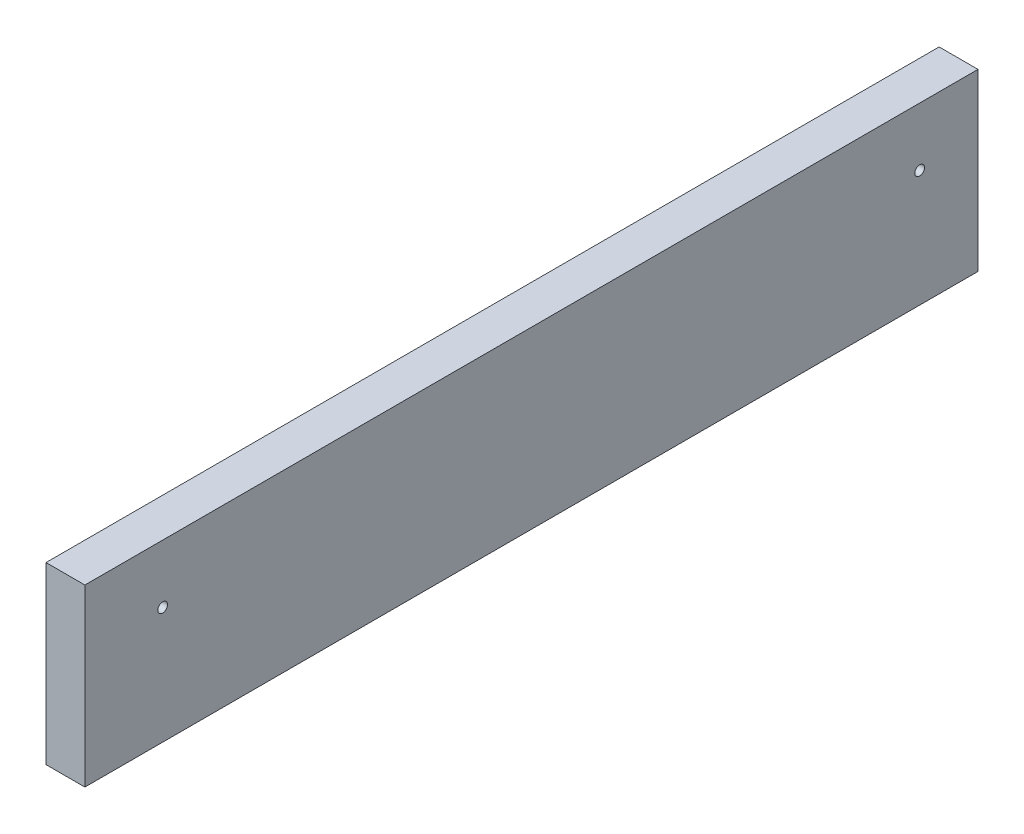
ISO-10303-21;
HEADER;
FILE_DESCRIPTION(('STEP AP214'),'2;1');
FILE_NAME('part.step','',(''),(''),'','','');
FILE_SCHEMA(('AUTOMOTIVE_DESIGN { 1 0 10303 214 1 1 1 1 }'));
ENDSEC;
DATA;
#1=APPLICATION_CONTEXT('core data for automotive mechanical design processes');
#2=APPLICATION_PROTOCOL_DEFINITION('international standard','automotive_design',2000,#1);
#3=PRODUCT_CONTEXT('',#1,'mechanical');
#4=PRODUCT('Part','Part','',(#3));
#5=PRODUCT_RELATED_PRODUCT_CATEGORY('part','',(#4));
#6=PRODUCT_DEFINITION_FORMATION('','',#4);
#7=PRODUCT_DEFINITION_CONTEXT('part definition',#1,'design');
#8=PRODUCT_DEFINITION('design','',#6,#7);
#9=PRODUCT_DEFINITION_SHAPE('','',#8);
#10=(LENGTH_UNIT() NAMED_UNIT(*) SI_UNIT(.MILLI.,.METRE.));
#11=(NAMED_UNIT(*) PLANE_ANGLE_UNIT() SI_UNIT($,.RADIAN.));
#12=(NAMED_UNIT(*) SI_UNIT($,.STERADIAN.) SOLID_ANGLE_UNIT());
#13=UNCERTAINTY_MEASURE_WITH_UNIT(LENGTH_MEASURE(1.E-05),#10,'distance_accuracy_value','');
#14=(GEOMETRIC_REPRESENTATION_CONTEXT(3) GLOBAL_UNCERTAINTY_ASSIGNED_CONTEXT((#13)) GLOBAL_UNIT_ASSIGNED_CONTEXT((#10,
#11,#12)) REPRESENTATION_CONTEXT('',''));
#15=CARTESIAN_POINT('',(0.,0.,0.));
#16=DIRECTION('',(0.,0.,1.));
#17=DIRECTION('',(1.,0.,0.));
#18=AXIS2_PLACEMENT_3D('',#15,#16,#17);
#19=CARTESIAN_POINT('',(-609.6,0.,311.624807795112));
#20=DIRECTION('',(1.,0.,0.));
#21=DIRECTION('',(0.,0.,-1.));
#22=AXIS2_PLACEMENT_3D('',#19,#20,#21);
#23=PLANE('',#22);
#24=CARTESIAN_POINT('',(-609.6,38.1,577.85));
#25=DIRECTION('',(-1.,0.,0.));
#26=DIRECTION('',(0.,0.,1.));
#27=AXIS2_PLACEMENT_3D('',#24,#25,#26);
#28=CIRCLE('',#27,1.5875);
#29=CARTESIAN_POINT('',(-609.6,38.1,579.4375));
#30=VERTEX_POINT('',#29);
#31=EDGE_CURVE('E82',#30,#30,#28,.T.);
#32=ORIENTED_EDGE('',*,*,#31,.T.);
#33=EDGE_LOOP('',(#32));
#34=FACE_BOUND('',#33,.T.);
#35=CARTESIAN_POINT('',(-609.6,38.1,330.674807795112));
#36=DIRECTION('',(-1.,0.,0.));
#37=DIRECTION('',(0.,0.,1.));
#38=AXIS2_PLACEMENT_3D('',#35,#36,#37);
#39=CIRCLE('',#38,1.5875);
#40=CARTESIAN_POINT('',(-609.6,38.1,332.262307795112));
#41=VERTEX_POINT('',#40);
#42=EDGE_CURVE('E19',#41,#41,#39,.T.);
#43=ORIENTED_EDGE('',*,*,#42,.T.);
#44=EDGE_LOOP('',(#43));
#45=FACE_BOUND('',#44,.T.);
#46=DIRECTION('',(0.,1.,0.));
#47=VECTOR('',#46,1.);
#48=CARTESIAN_POINT('',(-609.6,0.,603.25));
#49=LINE('',#48,#47);
#50=CARTESIAN_POINT('',(-609.6,0.,603.25));
#51=VERTEX_POINT('',#50);
#52=CARTESIAN_POINT('',(-609.6,57.15,603.25));
#53=VERTEX_POINT('',#52);
#54=EDGE_CURVE('E59',#51,#53,#49,.T.);
#55=ORIENTED_EDGE('',*,*,#54,.F.);
#56=DIRECTION('',(0.,0.,-1.));
#57=VECTOR('',#56,1.);
#58=CARTESIAN_POINT('',(-609.6,0.,0.));
#59=LINE('',#58,#57);
#60=CARTESIAN_POINT('',(-609.6,0.,311.624807795112));
#61=VERTEX_POINT('',#60);
#62=EDGE_CURVE('E91',#61,#51,#59,.F.);
#63=ORIENTED_EDGE('',*,*,#62,.F.);
#64=DIRECTION('',(0.,1.,0.));
#65=VECTOR('',#64,1.);
#66=CARTESIAN_POINT('',(-609.6,0.,311.624807795112));
#67=LINE('',#66,#65);
#68=CARTESIAN_POINT('',(-609.6,57.15,311.624807795112));
#69=VERTEX_POINT('',#68);
#70=EDGE_CURVE('E69',#69,#61,#67,.F.);
#71=ORIENTED_EDGE('',*,*,#70,.F.);
#72=DIRECTION('',(0.,0.,1.));
#73=VECTOR('',#72,1.);
#74=CARTESIAN_POINT('',(-609.6,57.15,0.));
#75=LINE('',#74,#73);
#76=EDGE_CURVE('E54',#53,#69,#75,.F.);
#77=ORIENTED_EDGE('',*,*,#76,.F.);
#78=EDGE_LOOP('',(#55,#63,#71,#77));
#79=FACE_BOUND('',#78,.T.);
#80=ADVANCED_FACE('F16',(#34,#45,#79),#23,.T.);
#81=CARTESIAN_POINT('',(-609.6,0.,603.25));
#82=DIRECTION('',(0.,0.,1.));
#83=DIRECTION('',(1.,0.,0.));
#84=AXIS2_PLACEMENT_3D('',#81,#82,#83);
#85=PLANE('',#84);
#86=DIRECTION('',(0.,1.,0.));
#87=VECTOR('',#86,1.);
#88=CARTESIAN_POINT('',(-622.3,0.,603.25));
#89=LINE('',#88,#87);
#90=CARTESIAN_POINT('',(-622.3,0.,603.25));
#91=VERTEX_POINT('',#90);
#92=CARTESIAN_POINT('',(-622.3,57.15,603.25));
#93=VERTEX_POINT('',#92);
#94=EDGE_CURVE('E84',#91,#93,#89,.T.);
#95=ORIENTED_EDGE('',*,*,#94,.F.);
#96=DIRECTION('',(1.,0.,0.));
#97=VECTOR('',#96,1.);
#98=CARTESIAN_POINT('',(0.,0.,603.25));
#99=LINE('',#98,#97);
#100=EDGE_CURVE('E64',#51,#91,#99,.F.);
#101=ORIENTED_EDGE('',*,*,#100,.F.);
#102=ORIENTED_EDGE('',*,*,#54,.T.);
#103=DIRECTION('',(1.,0.,0.));
#104=VECTOR('',#103,1.);
#105=CARTESIAN_POINT('',(0.,57.15,603.25));
#106=LINE('',#105,#104);
#107=EDGE_CURVE('E61',#93,#53,#106,.T.);
#108=ORIENTED_EDGE('',*,*,#107,.F.);
#109=EDGE_LOOP('',(#95,#101,#102,#108));
#110=FACE_BOUND('',#109,.T.);
#111=ADVANCED_FACE('F60',(#110),#85,.T.);
#112=CARTESIAN_POINT('',(0.,57.15,0.));
#113=DIRECTION('',(0.,1.,0.));
#114=DIRECTION('',(0.,0.,1.));
#115=AXIS2_PLACEMENT_3D('',#112,#113,#114);
#116=PLANE('',#115);
#117=DIRECTION('',(-1.,0.,0.));
#118=VECTOR('',#117,1.);
#119=CARTESIAN_POINT('',(-622.3,57.15,311.624807795112));
#120=LINE('',#119,#118);
#121=CARTESIAN_POINT('',(-622.3,57.15,311.624807795112));
#122=VERTEX_POINT('',#121);
#123=EDGE_CURVE('E71',#122,#69,#120,.F.);
#124=ORIENTED_EDGE('',*,*,#123,.F.);
#125=DIRECTION('',(0.,0.,1.));
#126=VECTOR('',#125,1.);
#127=CARTESIAN_POINT('',(-622.3,57.15,603.25));
#128=LINE('',#127,#126);
#129=EDGE_CURVE('E75',#93,#122,#128,.F.);
#130=ORIENTED_EDGE('',*,*,#129,.F.);
#131=ORIENTED_EDGE('',*,*,#107,.T.);
#132=ORIENTED_EDGE('',*,*,#76,.T.);
#133=EDGE_LOOP('',(#124,#130,#131,#132));
#134=FACE_BOUND('',#133,.T.);
#135=ADVANCED_FACE('F73',(#134),#116,.T.);
#136=CARTESIAN_POINT('',(-622.3,0.,311.624807795112));
#137=DIRECTION('',(0.,0.,-1.));
#138=DIRECTION('',(-1.,0.,0.));
#139=AXIS2_PLACEMENT_3D('',#136,#137,#138);
#140=PLANE('',#139);
#141=ORIENTED_EDGE('',*,*,#70,.T.);
#142=DIRECTION('',(1.,0.,0.));
#143=VECTOR('',#142,1.);
#144=CARTESIAN_POINT('',(0.,0.,311.624807795112));
#145=LINE('',#144,#143);
#146=CARTESIAN_POINT('',(-622.3,0.,311.624807795112));
#147=VERTEX_POINT('',#146);
#148=EDGE_CURVE('E34',#147,#61,#145,.T.);
#149=ORIENTED_EDGE('',*,*,#148,.F.);
#150=DIRECTION('',(0.,1.,0.));
#151=VECTOR('',#150,1.);
#152=CARTESIAN_POINT('',(-622.3,0.,311.624807795112));
#153=LINE('',#152,#151);
#154=EDGE_CURVE('E101',#122,#147,#153,.F.);
#155=ORIENTED_EDGE('',*,*,#154,.F.);
#156=ORIENTED_EDGE('',*,*,#123,.T.);
#157=EDGE_LOOP('',(#141,#149,#155,#156));
#158=FACE_BOUND('',#157,.T.);
#159=ADVANCED_FACE('F99',(#158),#140,.T.);
#160=CARTESIAN_POINT('',(0.,0.,0.));
#161=DIRECTION('',(0.,-1.,0.));
#162=DIRECTION('',(0.,0.,-1.));
#163=AXIS2_PLACEMENT_3D('',#160,#161,#162);
#164=PLANE('',#163);
#165=ORIENTED_EDGE('',*,*,#100,.T.);
#166=DIRECTION('',(0.,0.,1.));
#167=VECTOR('',#166,1.);
#168=CARTESIAN_POINT('',(-622.3,0.,603.25));
#169=LINE('',#168,#167);
#170=EDGE_CURVE('E81',#147,#91,#169,.T.);
#171=ORIENTED_EDGE('',*,*,#170,.F.);
#172=ORIENTED_EDGE('',*,*,#148,.T.);
#173=ORIENTED_EDGE('',*,*,#62,.T.);
#174=EDGE_LOOP('',(#165,#171,#172,#173));
#175=FACE_BOUND('',#174,.T.);
#176=ADVANCED_FACE('F106',(#175),#164,.T.);
#177=CARTESIAN_POINT('',(-622.3,38.1,330.674807795112));
#178=DIRECTION('',(-1.,0.,0.));
#179=DIRECTION('',(0.,0.,1.));
#180=AXIS2_PLACEMENT_3D('',#177,#178,#179);
#181=CYLINDRICAL_SURFACE('',#180,1.5875);
#182=ORIENTED_EDGE('',*,*,#42,.F.);
#183=EDGE_LOOP('',(#182));
#184=FACE_BOUND('',#183,.T.);
#185=CARTESIAN_POINT('',(-622.3,38.1,330.674807795112));
#186=DIRECTION('',(-1.,0.,0.));
#187=DIRECTION('',(0.,0.,1.));
#188=AXIS2_PLACEMENT_3D('',#185,#186,#187);
#189=CIRCLE('',#188,1.5875);
#190=CARTESIAN_POINT('',(-622.3,38.1,332.262307795112));
#191=VERTEX_POINT('',#190);
#192=EDGE_CURVE('E25',#191,#191,#189,.F.);
#193=ORIENTED_EDGE('',*,*,#192,.F.);
#194=EDGE_LOOP('',(#193));
#195=FACE_BOUND('',#194,.T.);
#196=ADVANCED_FACE('F108',(#184,#195),#181,.F.);
#197=CARTESIAN_POINT('',(-622.3,38.1,577.85));
#198=DIRECTION('',(-1.,0.,0.));
#199=DIRECTION('',(0.,0.,1.));
#200=AXIS2_PLACEMENT_3D('',#197,#198,#199);
#201=CYLINDRICAL_SURFACE('',#200,1.5875);
#202=ORIENTED_EDGE('',*,*,#31,.F.);
#203=EDGE_LOOP('',(#202));
#204=FACE_BOUND('',#203,.T.);
#205=CARTESIAN_POINT('',(-622.3,38.1,577.85));
#206=DIRECTION('',(-1.,0.,0.));
#207=DIRECTION('',(0.,0.,1.));
#208=AXIS2_PLACEMENT_3D('',#205,#206,#207);
#209=CIRCLE('',#208,1.5875);
#210=CARTESIAN_POINT('',(-622.3,38.1,579.4375));
#211=VERTEX_POINT('',#210);
#212=EDGE_CURVE('E11',#211,#211,#209,.F.);
#213=ORIENTED_EDGE('',*,*,#212,.F.);
#214=EDGE_LOOP('',(#213));
#215=FACE_BOUND('',#214,.T.);
#216=ADVANCED_FACE('F115',(#204,#215),#201,.F.);
#217=CARTESIAN_POINT('',(-622.3,0.,603.25));
#218=DIRECTION('',(-1.,0.,0.));
#219=DIRECTION('',(0.,0.,1.));
#220=AXIS2_PLACEMENT_3D('',#217,#218,#219);
#221=PLANE('',#220);
#222=ORIENTED_EDGE('',*,*,#212,.T.);
#223=EDGE_LOOP('',(#222));
#224=FACE_BOUND('',#223,.T.);
#225=ORIENTED_EDGE('',*,*,#192,.T.);
#226=EDGE_LOOP('',(#225));
#227=FACE_BOUND('',#226,.T.);
#228=ORIENTED_EDGE('',*,*,#154,.T.);
#229=ORIENTED_EDGE('',*,*,#170,.T.);
#230=ORIENTED_EDGE('',*,*,#94,.T.);
#231=ORIENTED_EDGE('',*,*,#129,.T.);
#232=EDGE_LOOP('',(#228,#229,#230,#231));
#233=FACE_BOUND('',#232,.T.);
#234=ADVANCED_FACE('F104',(#224,#227,#233),#221,.T.);
#235=CLOSED_SHELL('',(#80,#111,#135,#159,#176,#196,#216,#234));
#236=MANIFOLD_SOLID_BREP('B1',#235);
#237=ADVANCED_BREP_SHAPE_REPRESENTATION('',(#18,#236),#14);
#238=SHAPE_DEFINITION_REPRESENTATION(#9,#237);
ENDSEC;
END-ISO-10303-21;
